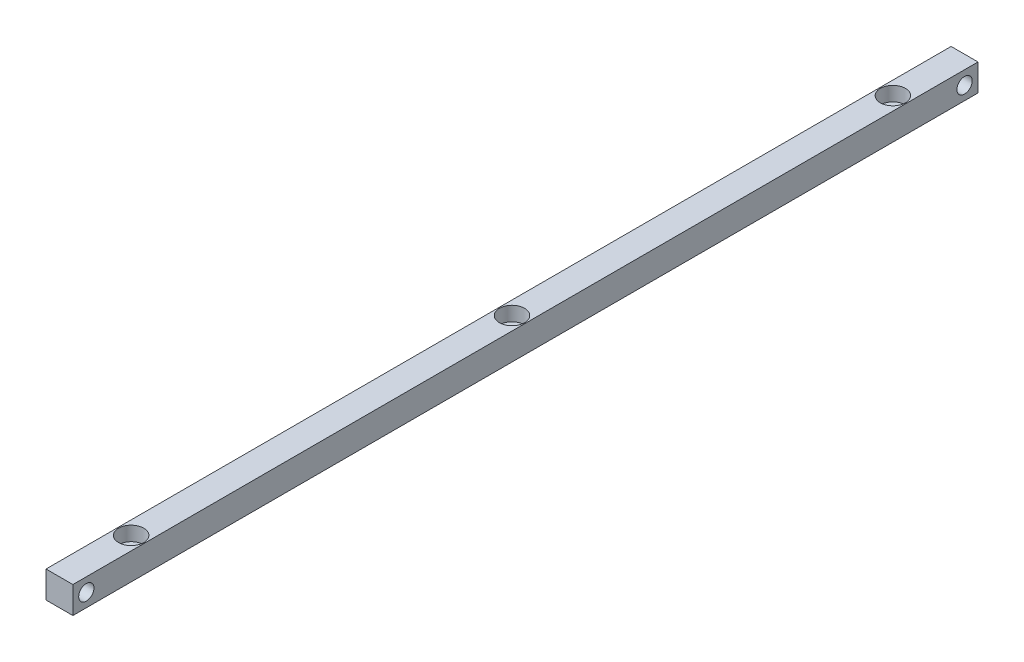
ISO-10303-21;
HEADER;
FILE_DESCRIPTION(('STEP AP214'),'2;1');
FILE_NAME('part.step','',(''),(''),'','','');
FILE_SCHEMA(('AUTOMOTIVE_DESIGN { 1 0 10303 214 1 1 1 1 }'));
ENDSEC;
DATA;
#1=APPLICATION_CONTEXT('core data for automotive mechanical design processes');
#2=APPLICATION_PROTOCOL_DEFINITION('international standard','automotive_design',2000,#1);
#3=PRODUCT_CONTEXT('',#1,'mechanical');
#4=PRODUCT('Part','Part','',(#3));
#5=PRODUCT_RELATED_PRODUCT_CATEGORY('part','',(#4));
#6=PRODUCT_DEFINITION_FORMATION('','',#4);
#7=PRODUCT_DEFINITION_CONTEXT('part definition',#1,'design');
#8=PRODUCT_DEFINITION('design','',#6,#7);
#9=PRODUCT_DEFINITION_SHAPE('','',#8);
#10=(LENGTH_UNIT() NAMED_UNIT(*) SI_UNIT(.MILLI.,.METRE.));
#11=(NAMED_UNIT(*) PLANE_ANGLE_UNIT() SI_UNIT($,.RADIAN.));
#12=(NAMED_UNIT(*) SI_UNIT($,.STERADIAN.) SOLID_ANGLE_UNIT());
#13=UNCERTAINTY_MEASURE_WITH_UNIT(LENGTH_MEASURE(1.E-05),#10,'distance_accuracy_value','');
#14=(GEOMETRIC_REPRESENTATION_CONTEXT(3) GLOBAL_UNCERTAINTY_ASSIGNED_CONTEXT((#13)) GLOBAL_UNIT_ASSIGNED_CONTEXT((#10,
#11,#12)) REPRESENTATION_CONTEXT('',''));
#15=CARTESIAN_POINT('',(0.,0.,0.));
#16=DIRECTION('',(0.,0.,1.));
#17=DIRECTION('',(1.,0.,0.));
#18=AXIS2_PLACEMENT_3D('',#15,#16,#17);
#19=CARTESIAN_POINT('',(0.,7.5,-212.5));
#20=DIRECTION('',(0.,1.,0.));
#21=DIRECTION('',(0.,0.,1.));
#22=AXIS2_PLACEMENT_3D('',#19,#20,#21);
#23=CYLINDRICAL_SURFACE('',#22,7.00000000000001);
#24=CARTESIAN_POINT('',(0.,-0.500000000000001,-212.5));
#25=DIRECTION('',(0.,1.,0.));
#26=DIRECTION('',(0.,0.,1.));
#27=AXIS2_PLACEMENT_3D('',#24,#25,#26);
#28=CIRCLE('',#27,7.00000000000001);
#29=CARTESIAN_POINT('',(0.,-0.500000000000001,-205.5));
#30=VERTEX_POINT('',#29);
#31=EDGE_CURVE('E11',#30,#30,#28,.T.);
#32=ORIENTED_EDGE('',*,*,#31,.F.);
#33=EDGE_LOOP('',(#32));
#34=FACE_BOUND('',#33,.T.);
#35=CARTESIAN_POINT('',(0.,7.5,-212.5));
#36=DIRECTION('',(0.,1.,0.));
#37=DIRECTION('',(0.,0.,1.));
#38=AXIS2_PLACEMENT_3D('',#35,#36,#37);
#39=CIRCLE('',#38,7.00000000000001);
#40=CARTESIAN_POINT('',(0.,7.5,-205.5));
#41=VERTEX_POINT('',#40);
#42=EDGE_CURVE('E128',#41,#41,#39,.T.);
#43=ORIENTED_EDGE('',*,*,#42,.T.);
#44=EDGE_LOOP('',(#43));
#45=FACE_BOUND('',#44,.T.);
#46=ADVANCED_FACE('F38',(#34,#45),#23,.F.);
#47=CARTESIAN_POINT('',(4.25000000000001,-0.500000000000001,-212.5));
#48=DIRECTION('',(0.,-1.,0.));
#49=DIRECTION('',(0.,0.,-1.));
#50=AXIS2_PLACEMENT_3D('',#47,#48,#49);
#51=PLANE('',#50);
#52=CARTESIAN_POINT('',(0.,-0.500000000000001,-212.5));
#53=DIRECTION('',(0.,1.,0.));
#54=DIRECTION('',(0.,0.,1.));
#55=AXIS2_PLACEMENT_3D('',#52,#53,#54);
#56=CIRCLE('',#55,4.25000000000001);
#57=CARTESIAN_POINT('',(0.,-0.500000000000001,-208.25));
#58=VERTEX_POINT('',#57);
#59=EDGE_CURVE('E47',#58,#58,#56,.T.);
#60=ORIENTED_EDGE('',*,*,#59,.F.);
#61=EDGE_LOOP('',(#60));
#62=FACE_BOUND('',#61,.T.);
#63=ORIENTED_EDGE('',*,*,#31,.T.);
#64=EDGE_LOOP('',(#63));
#65=FACE_BOUND('',#64,.T.);
#66=ADVANCED_FACE('F141',(#62,#65),#51,.F.);
#67=CARTESIAN_POINT('',(0.,7.5,-212.5));
#68=DIRECTION('',(0.,1.,0.));
#69=DIRECTION('',(0.,0.,1.));
#70=AXIS2_PLACEMENT_3D('',#67,#68,#69);
#71=CYLINDRICAL_SURFACE('',#70,4.25000000000001);
#72=CARTESIAN_POINT('',(0.,-7.5,-212.5));
#73=DIRECTION('',(0.,1.,0.));
#74=DIRECTION('',(0.,0.,1.));
#75=AXIS2_PLACEMENT_3D('',#72,#73,#74);
#76=CIRCLE('',#75,4.25000000000001);
#77=CARTESIAN_POINT('',(0.,-7.5,-208.25));
#78=VERTEX_POINT('',#77);
#79=EDGE_CURVE('E132',#78,#78,#76,.T.);
#80=ORIENTED_EDGE('',*,*,#79,.F.);
#81=EDGE_LOOP('',(#80));
#82=FACE_BOUND('',#81,.T.);
#83=ORIENTED_EDGE('',*,*,#59,.T.);
#84=EDGE_LOOP('',(#83));
#85=FACE_BOUND('',#84,.T.);
#86=ADVANCED_FACE('F139',(#82,#85),#71,.F.);
#87=CARTESIAN_POINT('',(7.5,-7.5,252.5));
#88=DIRECTION('',(-1.,0.,0.));
#89=DIRECTION('',(0.,0.,1.));
#90=AXIS2_PLACEMENT_3D('',#87,#88,#89);
#91=PLANE('',#90);
#92=CARTESIAN_POINT('',(7.5,0.,-245.));
#93=DIRECTION('',(-1.,0.,0.));
#94=DIRECTION('',(0.,0.,1.));
#95=AXIS2_PLACEMENT_3D('',#92,#93,#94);
#96=CIRCLE('',#95,4.25000000000001);
#97=CARTESIAN_POINT('',(7.5,0.,-240.75));
#98=VERTEX_POINT('',#97);
#99=EDGE_CURVE('E281',#98,#98,#96,.T.);
#100=ORIENTED_EDGE('',*,*,#99,.T.);
#101=EDGE_LOOP('',(#100));
#102=FACE_BOUND('',#101,.T.);
#103=CARTESIAN_POINT('',(7.5,0.,245.));
#104=DIRECTION('',(-1.,0.,0.));
#105=DIRECTION('',(0.,0.,1.));
#106=AXIS2_PLACEMENT_3D('',#103,#104,#105);
#107=CIRCLE('',#106,4.25000000000001);
#108=CARTESIAN_POINT('',(7.5,0.,249.25));
#109=VERTEX_POINT('',#108);
#110=EDGE_CURVE('E115',#109,#109,#107,.T.);
#111=ORIENTED_EDGE('',*,*,#110,.T.);
#112=EDGE_LOOP('',(#111));
#113=FACE_BOUND('',#112,.T.);
#114=DIRECTION('',(0.,1.,0.));
#115=VECTOR('',#114,1.);
#116=CARTESIAN_POINT('',(7.5,-7.5,-252.5));
#117=LINE('',#116,#115);
#118=CARTESIAN_POINT('',(7.5,-7.5,-252.5));
#119=VERTEX_POINT('',#118);
#120=CARTESIAN_POINT('',(7.5,7.5,-252.5));
#121=VERTEX_POINT('',#120);
#122=EDGE_CURVE('E111',#119,#121,#117,.T.);
#123=ORIENTED_EDGE('',*,*,#122,.T.);
#124=DIRECTION('',(0.,0.,-1.));
#125=VECTOR('',#124,1.);
#126=CARTESIAN_POINT('',(7.5,7.5,252.5));
#127=LINE('',#126,#125);
#128=CARTESIAN_POINT('',(7.5,7.5,252.5));
#129=VERTEX_POINT('',#128);
#130=EDGE_CURVE('E100',#129,#121,#127,.T.);
#131=ORIENTED_EDGE('',*,*,#130,.F.);
#132=DIRECTION('',(0.,1.,0.));
#133=VECTOR('',#132,1.);
#134=CARTESIAN_POINT('',(7.5,-7.5,252.5));
#135=LINE('',#134,#133);
#136=CARTESIAN_POINT('',(7.5,-7.5,252.5));
#137=VERTEX_POINT('',#136);
#138=EDGE_CURVE('E91',#137,#129,#135,.T.);
#139=ORIENTED_EDGE('',*,*,#138,.F.);
#140=DIRECTION('',(0.,0.,-1.));
#141=VECTOR('',#140,1.);
#142=CARTESIAN_POINT('',(7.5,-7.5,252.5));
#143=LINE('',#142,#141);
#144=EDGE_CURVE('E107',#137,#119,#143,.T.);
#145=ORIENTED_EDGE('',*,*,#144,.T.);
#146=EDGE_LOOP('',(#123,#131,#139,#145));
#147=FACE_BOUND('',#146,.T.);
#148=ADVANCED_FACE('F150',(#102,#113,#147),#91,.F.);
#149=CARTESIAN_POINT('',(-7.5,7.5,252.5));
#150=DIRECTION('',(0.,-1.,0.));
#151=DIRECTION('',(0.,0.,-1.));
#152=AXIS2_PLACEMENT_3D('',#149,#150,#151);
#153=PLANE('',#152);
#154=CARTESIAN_POINT('',(0.,7.5,0.));
#155=DIRECTION('',(0.,1.,0.));
#156=DIRECTION('',(0.,0.,1.));
#157=AXIS2_PLACEMENT_3D('',#154,#155,#156);
#158=CIRCLE('',#157,7.00000000000001);
#159=CARTESIAN_POINT('',(0.,7.5,7.00000000000001));
#160=VERTEX_POINT('',#159);
#161=EDGE_CURVE('E240',#160,#160,#158,.T.);
#162=ORIENTED_EDGE('',*,*,#161,.F.);
#163=EDGE_LOOP('',(#162));
#164=FACE_BOUND('',#163,.T.);
#165=CARTESIAN_POINT('',(0.,7.5,212.5));
#166=DIRECTION('',(0.,1.,0.));
#167=DIRECTION('',(0.,0.,1.));
#168=AXIS2_PLACEMENT_3D('',#165,#166,#167);
#169=CIRCLE('',#168,7.00000000000001);
#170=CARTESIAN_POINT('',(0.,7.5,219.5));
#171=VERTEX_POINT('',#170);
#172=EDGE_CURVE('E253',#171,#171,#169,.T.);
#173=ORIENTED_EDGE('',*,*,#172,.F.);
#174=EDGE_LOOP('',(#173));
#175=FACE_BOUND('',#174,.T.);
#176=DIRECTION('',(-1.,0.,0.));
#177=VECTOR('',#176,1.);
#178=CARTESIAN_POINT('',(-7.5,7.5,-252.5));
#179=LINE('',#178,#177);
#180=CARTESIAN_POINT('',(-7.5,7.5,-252.5));
#181=VERTEX_POINT('',#180);
#182=EDGE_CURVE('E98',#121,#181,#179,.T.);
#183=ORIENTED_EDGE('',*,*,#182,.T.);
#184=DIRECTION('',(0.,0.,-1.));
#185=VECTOR('',#184,1.);
#186=CARTESIAN_POINT('',(-7.5,7.5,252.5));
#187=LINE('',#186,#185);
#188=CARTESIAN_POINT('',(-7.5,7.5,252.5));
#189=VERTEX_POINT('',#188);
#190=EDGE_CURVE('E95',#189,#181,#187,.T.);
#191=ORIENTED_EDGE('',*,*,#190,.F.);
#192=DIRECTION('',(-1.,0.,0.));
#193=VECTOR('',#192,1.);
#194=CARTESIAN_POINT('',(-7.5,7.5,252.5));
#195=LINE('',#194,#193);
#196=EDGE_CURVE('E86',#129,#189,#195,.T.);
#197=ORIENTED_EDGE('',*,*,#196,.F.);
#198=ORIENTED_EDGE('',*,*,#130,.T.);
#199=EDGE_LOOP('',(#183,#191,#197,#198));
#200=FACE_BOUND('',#199,.T.);
#201=ORIENTED_EDGE('',*,*,#42,.F.);
#202=EDGE_LOOP('',(#201));
#203=FACE_BOUND('',#202,.T.);
#204=ADVANCED_FACE('F96',(#164,#175,#200,#203),#153,.F.);
#205=CARTESIAN_POINT('',(-7.5,-7.5,252.5));
#206=DIRECTION('',(1.,0.,0.));
#207=DIRECTION('',(0.,0.,-1.));
#208=AXIS2_PLACEMENT_3D('',#205,#206,#207);
#209=PLANE('',#208);
#210=CARTESIAN_POINT('',(-7.5,0.,-245.));
#211=DIRECTION('',(-1.,0.,0.));
#212=DIRECTION('',(0.,0.,1.));
#213=AXIS2_PLACEMENT_3D('',#210,#211,#212);
#214=CIRCLE('',#213,7.00000000000001);
#215=CARTESIAN_POINT('',(-7.5,0.,-238.));
#216=VERTEX_POINT('',#215);
#217=EDGE_CURVE('E269',#216,#216,#214,.T.);
#218=ORIENTED_EDGE('',*,*,#217,.F.);
#219=EDGE_LOOP('',(#218));
#220=FACE_BOUND('',#219,.T.);
#221=CARTESIAN_POINT('',(-7.5,0.,245.));
#222=DIRECTION('',(-1.,0.,0.));
#223=DIRECTION('',(0.,0.,1.));
#224=AXIS2_PLACEMENT_3D('',#221,#222,#223);
#225=CIRCLE('',#224,7.00000000000001);
#226=CARTESIAN_POINT('',(-7.5,0.,252.));
#227=VERTEX_POINT('',#226);
#228=EDGE_CURVE('E285',#227,#227,#225,.T.);
#229=ORIENTED_EDGE('',*,*,#228,.F.);
#230=EDGE_LOOP('',(#229));
#231=FACE_BOUND('',#230,.T.);
#232=DIRECTION('',(0.,-1.,0.));
#233=VECTOR('',#232,1.);
#234=CARTESIAN_POINT('',(-7.5,-7.5,-252.5));
#235=LINE('',#234,#233);
#236=CARTESIAN_POINT('',(-7.5,-7.5,-252.5));
#237=VERTEX_POINT('',#236);
#238=EDGE_CURVE('E72',#181,#237,#235,.T.);
#239=ORIENTED_EDGE('',*,*,#238,.T.);
#240=DIRECTION('',(0.,0.,-1.));
#241=VECTOR('',#240,1.);
#242=CARTESIAN_POINT('',(-7.5,-7.5,252.5));
#243=LINE('',#242,#241);
#244=CARTESIAN_POINT('',(-7.5,-7.5,252.5));
#245=VERTEX_POINT('',#244);
#246=EDGE_CURVE('E101',#245,#237,#243,.T.);
#247=ORIENTED_EDGE('',*,*,#246,.F.);
#248=DIRECTION('',(0.,-1.,0.));
#249=VECTOR('',#248,1.);
#250=CARTESIAN_POINT('',(-7.5,-7.5,252.5));
#251=LINE('',#250,#249);
#252=EDGE_CURVE('E89',#189,#245,#251,.T.);
#253=ORIENTED_EDGE('',*,*,#252,.F.);
#254=ORIENTED_EDGE('',*,*,#190,.T.);
#255=EDGE_LOOP('',(#239,#247,#253,#254));
#256=FACE_BOUND('',#255,.T.);
#257=ADVANCED_FACE('F103',(#220,#231,#256),#209,.F.);
#258=CARTESIAN_POINT('',(-7.5,-7.5,252.5));
#259=DIRECTION('',(0.,1.,0.));
#260=DIRECTION('',(0.,0.,1.));
#261=AXIS2_PLACEMENT_3D('',#258,#259,#260);
#262=PLANE('',#261);
#263=CARTESIAN_POINT('',(0.,-7.5,0.));
#264=DIRECTION('',(0.,1.,0.));
#265=DIRECTION('',(0.,0.,1.));
#266=AXIS2_PLACEMENT_3D('',#263,#264,#265);
#267=CIRCLE('',#266,4.25000000000001);
#268=CARTESIAN_POINT('',(0.,-7.5,4.25000000000001));
#269=VERTEX_POINT('',#268);
#270=EDGE_CURVE('E242',#269,#269,#267,.T.);
#271=ORIENTED_EDGE('',*,*,#270,.T.);
#272=EDGE_LOOP('',(#271));
#273=FACE_BOUND('',#272,.T.);
#274=CARTESIAN_POINT('',(0.,-7.5,212.5));
#275=DIRECTION('',(0.,1.,0.));
#276=DIRECTION('',(0.,0.,1.));
#277=AXIS2_PLACEMENT_3D('',#274,#275,#276);
#278=CIRCLE('',#277,4.25000000000001);
#279=CARTESIAN_POINT('',(0.,-7.5,216.75));
#280=VERTEX_POINT('',#279);
#281=EDGE_CURVE('E265',#280,#280,#278,.T.);
#282=ORIENTED_EDGE('',*,*,#281,.T.);
#283=EDGE_LOOP('',(#282));
#284=FACE_BOUND('',#283,.T.);
#285=DIRECTION('',(1.,0.,0.));
#286=VECTOR('',#285,1.);
#287=CARTESIAN_POINT('',(-7.5,-7.5,-252.5));
#288=LINE('',#287,#286);
#289=EDGE_CURVE('E78',#237,#119,#288,.T.);
#290=ORIENTED_EDGE('',*,*,#289,.T.);
#291=ORIENTED_EDGE('',*,*,#144,.F.);
#292=DIRECTION('',(1.,0.,0.));
#293=VECTOR('',#292,1.);
#294=CARTESIAN_POINT('',(-7.5,-7.5,252.5));
#295=LINE('',#294,#293);
#296=EDGE_CURVE('E55',#245,#137,#295,.T.);
#297=ORIENTED_EDGE('',*,*,#296,.F.);
#298=ORIENTED_EDGE('',*,*,#246,.T.);
#299=EDGE_LOOP('',(#290,#291,#297,#298));
#300=FACE_BOUND('',#299,.T.);
#301=ORIENTED_EDGE('',*,*,#79,.T.);
#302=EDGE_LOOP('',(#301));
#303=FACE_BOUND('',#302,.T.);
#304=ADVANCED_FACE('F158',(#273,#284,#300,#303),#262,.F.);
#305=CARTESIAN_POINT('',(0.,0.,252.5));
#306=DIRECTION('',(0.,0.,-1.));
#307=DIRECTION('',(-1.,0.,0.));
#308=AXIS2_PLACEMENT_3D('',#305,#306,#307);
#309=PLANE('',#308);
#310=ORIENTED_EDGE('',*,*,#138,.T.);
#311=ORIENTED_EDGE('',*,*,#196,.T.);
#312=ORIENTED_EDGE('',*,*,#252,.T.);
#313=ORIENTED_EDGE('',*,*,#296,.T.);
#314=EDGE_LOOP('',(#310,#311,#312,#313));
#315=FACE_BOUND('',#314,.T.);
#316=ADVANCED_FACE('F87',(#315),#309,.F.);
#317=CARTESIAN_POINT('',(0.,0.,-252.5));
#318=DIRECTION('',(0.,0.,-1.));
#319=DIRECTION('',(-1.,0.,0.));
#320=AXIS2_PLACEMENT_3D('',#317,#318,#319);
#321=PLANE('',#320);
#322=ORIENTED_EDGE('',*,*,#122,.F.);
#323=ORIENTED_EDGE('',*,*,#289,.F.);
#324=ORIENTED_EDGE('',*,*,#238,.F.);
#325=ORIENTED_EDGE('',*,*,#182,.F.);
#326=EDGE_LOOP('',(#322,#323,#324,#325));
#327=FACE_BOUND('',#326,.T.);
#328=ADVANCED_FACE('F179',(#327),#321,.T.);
#329=CARTESIAN_POINT('',(-7.5,0.,245.));
#330=DIRECTION('',(-1.,0.,0.));
#331=DIRECTION('',(0.,0.,1.));
#332=AXIS2_PLACEMENT_3D('',#329,#330,#331);
#333=CYLINDRICAL_SURFACE('',#332,4.25000000000001);
#334=ORIENTED_EDGE('',*,*,#110,.F.);
#335=EDGE_LOOP('',(#334));
#336=FACE_BOUND('',#335,.T.);
#337=CARTESIAN_POINT('',(0.499999999999999,0.,245.));
#338=DIRECTION('',(-1.,0.,0.));
#339=DIRECTION('',(0.,0.,1.));
#340=AXIS2_PLACEMENT_3D('',#337,#338,#339);
#341=CIRCLE('',#340,4.25000000000001);
#342=CARTESIAN_POINT('',(0.499999999999999,0.,249.25));
#343=VERTEX_POINT('',#342);
#344=EDGE_CURVE('E293',#343,#343,#341,.T.);
#345=ORIENTED_EDGE('',*,*,#344,.T.);
#346=EDGE_LOOP('',(#345));
#347=FACE_BOUND('',#346,.T.);
#348=ADVANCED_FACE('F185',(#336,#347),#333,.F.);
#349=CARTESIAN_POINT('',(0.499999999999999,4.25000000000001,245.));
#350=DIRECTION('',(1.,0.,0.));
#351=DIRECTION('',(0.,0.,-1.));
#352=AXIS2_PLACEMENT_3D('',#349,#350,#351);
#353=PLANE('',#352);
#354=ORIENTED_EDGE('',*,*,#344,.F.);
#355=EDGE_LOOP('',(#354));
#356=FACE_BOUND('',#355,.T.);
#357=CARTESIAN_POINT('',(0.499999999999999,0.,245.));
#358=DIRECTION('',(-1.,0.,0.));
#359=DIRECTION('',(0.,0.,1.));
#360=AXIS2_PLACEMENT_3D('',#357,#358,#359);
#361=CIRCLE('',#360,7.00000000000001);
#362=CARTESIAN_POINT('',(0.499999999999999,0.,252.));
#363=VERTEX_POINT('',#362);
#364=EDGE_CURVE('E289',#363,#363,#361,.T.);
#365=ORIENTED_EDGE('',*,*,#364,.T.);
#366=EDGE_LOOP('',(#365));
#367=FACE_BOUND('',#366,.T.);
#368=ADVANCED_FACE('F190',(#356,#367),#353,.F.);
#369=CARTESIAN_POINT('',(-7.5,0.,245.));
#370=DIRECTION('',(-1.,0.,0.));
#371=DIRECTION('',(0.,0.,1.));
#372=AXIS2_PLACEMENT_3D('',#369,#370,#371);
#373=CYLINDRICAL_SURFACE('',#372,7.00000000000001);
#374=ORIENTED_EDGE('',*,*,#364,.F.);
#375=EDGE_LOOP('',(#374));
#376=FACE_BOUND('',#375,.T.);
#377=ORIENTED_EDGE('',*,*,#228,.T.);
#378=EDGE_LOOP('',(#377));
#379=FACE_BOUND('',#378,.T.);
#380=ADVANCED_FACE('F194',(#376,#379),#373,.F.);
#381=CARTESIAN_POINT('',(-7.5,0.,-245.));
#382=DIRECTION('',(-1.,0.,0.));
#383=DIRECTION('',(0.,0.,1.));
#384=AXIS2_PLACEMENT_3D('',#381,#382,#383);
#385=CYLINDRICAL_SURFACE('',#384,4.25000000000001);
#386=ORIENTED_EDGE('',*,*,#99,.F.);
#387=EDGE_LOOP('',(#386));
#388=FACE_BOUND('',#387,.T.);
#389=CARTESIAN_POINT('',(0.499999999999999,0.,-245.));
#390=DIRECTION('',(-1.,0.,0.));
#391=DIRECTION('',(0.,0.,1.));
#392=AXIS2_PLACEMENT_3D('',#389,#390,#391);
#393=CIRCLE('',#392,4.25000000000001);
#394=CARTESIAN_POINT('',(0.499999999999999,0.,-240.75));
#395=VERTEX_POINT('',#394);
#396=EDGE_CURVE('E277',#395,#395,#393,.T.);
#397=ORIENTED_EDGE('',*,*,#396,.T.);
#398=EDGE_LOOP('',(#397));
#399=FACE_BOUND('',#398,.T.);
#400=ADVANCED_FACE('F198',(#388,#399),#385,.F.);
#401=CARTESIAN_POINT('',(0.499999999999999,4.25000000000001,-245.));
#402=DIRECTION('',(1.,0.,0.));
#403=DIRECTION('',(0.,0.,-1.));
#404=AXIS2_PLACEMENT_3D('',#401,#402,#403);
#405=PLANE('',#404);
#406=ORIENTED_EDGE('',*,*,#396,.F.);
#407=EDGE_LOOP('',(#406));
#408=FACE_BOUND('',#407,.T.);
#409=CARTESIAN_POINT('',(0.499999999999999,0.,-245.));
#410=DIRECTION('',(-1.,0.,0.));
#411=DIRECTION('',(0.,0.,1.));
#412=AXIS2_PLACEMENT_3D('',#409,#410,#411);
#413=CIRCLE('',#412,7.00000000000001);
#414=CARTESIAN_POINT('',(0.499999999999999,0.,-238.));
#415=VERTEX_POINT('',#414);
#416=EDGE_CURVE('E273',#415,#415,#413,.T.);
#417=ORIENTED_EDGE('',*,*,#416,.T.);
#418=EDGE_LOOP('',(#417));
#419=FACE_BOUND('',#418,.T.);
#420=ADVANCED_FACE('F202',(#408,#419),#405,.F.);
#421=CARTESIAN_POINT('',(-7.5,0.,-245.));
#422=DIRECTION('',(-1.,0.,0.));
#423=DIRECTION('',(0.,0.,1.));
#424=AXIS2_PLACEMENT_3D('',#421,#422,#423);
#425=CYLINDRICAL_SURFACE('',#424,7.00000000000001);
#426=ORIENTED_EDGE('',*,*,#416,.F.);
#427=EDGE_LOOP('',(#426));
#428=FACE_BOUND('',#427,.T.);
#429=ORIENTED_EDGE('',*,*,#217,.T.);
#430=EDGE_LOOP('',(#429));
#431=FACE_BOUND('',#430,.T.);
#432=ADVANCED_FACE('F206',(#428,#431),#425,.F.);
#433=CARTESIAN_POINT('',(0.,7.5,212.5));
#434=DIRECTION('',(0.,1.,0.));
#435=DIRECTION('',(0.,0.,1.));
#436=AXIS2_PLACEMENT_3D('',#433,#434,#435);
#437=CYLINDRICAL_SURFACE('',#436,4.25000000000001);
#438=ORIENTED_EDGE('',*,*,#281,.F.);
#439=EDGE_LOOP('',(#438));
#440=FACE_BOUND('',#439,.T.);
#441=CARTESIAN_POINT('',(0.,-0.500000000000001,212.5));
#442=DIRECTION('',(0.,1.,0.));
#443=DIRECTION('',(0.,0.,1.));
#444=AXIS2_PLACEMENT_3D('',#441,#442,#443);
#445=CIRCLE('',#444,4.25000000000001);
#446=CARTESIAN_POINT('',(0.,-0.500000000000001,216.75));
#447=VERTEX_POINT('',#446);
#448=EDGE_CURVE('E261',#447,#447,#445,.T.);
#449=ORIENTED_EDGE('',*,*,#448,.T.);
#450=EDGE_LOOP('',(#449));
#451=FACE_BOUND('',#450,.T.);
#452=ADVANCED_FACE('F210',(#440,#451),#437,.F.);
#453=CARTESIAN_POINT('',(4.25000000000001,-0.500000000000001,212.5));
#454=DIRECTION('',(0.,-1.,0.));
#455=DIRECTION('',(0.,0.,-1.));
#456=AXIS2_PLACEMENT_3D('',#453,#454,#455);
#457=PLANE('',#456);
#458=ORIENTED_EDGE('',*,*,#448,.F.);
#459=EDGE_LOOP('',(#458));
#460=FACE_BOUND('',#459,.T.);
#461=CARTESIAN_POINT('',(0.,-0.500000000000001,212.5));
#462=DIRECTION('',(0.,1.,0.));
#463=DIRECTION('',(0.,0.,1.));
#464=AXIS2_PLACEMENT_3D('',#461,#462,#463);
#465=CIRCLE('',#464,7.00000000000001);
#466=CARTESIAN_POINT('',(0.,-0.500000000000001,219.5));
#467=VERTEX_POINT('',#466);
#468=EDGE_CURVE('E257',#467,#467,#465,.T.);
#469=ORIENTED_EDGE('',*,*,#468,.T.);
#470=EDGE_LOOP('',(#469));
#471=FACE_BOUND('',#470,.T.);
#472=ADVANCED_FACE('F213',(#460,#471),#457,.F.);
#473=CARTESIAN_POINT('',(0.,7.5,212.5));
#474=DIRECTION('',(0.,1.,0.));
#475=DIRECTION('',(0.,0.,1.));
#476=AXIS2_PLACEMENT_3D('',#473,#474,#475);
#477=CYLINDRICAL_SURFACE('',#476,7.00000000000001);
#478=ORIENTED_EDGE('',*,*,#468,.F.);
#479=EDGE_LOOP('',(#478));
#480=FACE_BOUND('',#479,.T.);
#481=ORIENTED_EDGE('',*,*,#172,.T.);
#482=EDGE_LOOP('',(#481));
#483=FACE_BOUND('',#482,.T.);
#484=ADVANCED_FACE('F217',(#480,#483),#477,.F.);
#485=CARTESIAN_POINT('',(0.,7.5,0.));
#486=DIRECTION('',(0.,1.,0.));
#487=DIRECTION('',(0.,0.,1.));
#488=AXIS2_PLACEMENT_3D('',#485,#486,#487);
#489=CYLINDRICAL_SURFACE('',#488,4.25000000000001);
#490=ORIENTED_EDGE('',*,*,#270,.F.);
#491=EDGE_LOOP('',(#490));
#492=FACE_BOUND('',#491,.T.);
#493=CARTESIAN_POINT('',(0.,-0.500000000000001,0.));
#494=DIRECTION('',(0.,1.,0.));
#495=DIRECTION('',(0.,0.,1.));
#496=AXIS2_PLACEMENT_3D('',#493,#494,#495);
#497=CIRCLE('',#496,4.25000000000001);
#498=CARTESIAN_POINT('',(0.,-0.500000000000001,4.25000000000001));
#499=VERTEX_POINT('',#498);
#500=EDGE_CURVE('E249',#499,#499,#497,.T.);
#501=ORIENTED_EDGE('',*,*,#500,.T.);
#502=EDGE_LOOP('',(#501));
#503=FACE_BOUND('',#502,.T.);
#504=ADVANCED_FACE('F221',(#492,#503),#489,.F.);
#505=CARTESIAN_POINT('',(4.25000000000001,-0.500000000000001,0.));
#506=DIRECTION('',(0.,-1.,0.));
#507=DIRECTION('',(0.,0.,-1.));
#508=AXIS2_PLACEMENT_3D('',#505,#506,#507);
#509=PLANE('',#508);
#510=ORIENTED_EDGE('',*,*,#500,.F.);
#511=EDGE_LOOP('',(#510));
#512=FACE_BOUND('',#511,.T.);
#513=CARTESIAN_POINT('',(0.,-0.500000000000001,0.));
#514=DIRECTION('',(0.,1.,0.));
#515=DIRECTION('',(0.,0.,1.));
#516=AXIS2_PLACEMENT_3D('',#513,#514,#515);
#517=CIRCLE('',#516,7.00000000000001);
#518=CARTESIAN_POINT('',(0.,-0.500000000000001,7.00000000000001));
#519=VERTEX_POINT('',#518);
#520=EDGE_CURVE('E238',#519,#519,#517,.T.);
#521=ORIENTED_EDGE('',*,*,#520,.T.);
#522=EDGE_LOOP('',(#521));
#523=FACE_BOUND('',#522,.T.);
#524=ADVANCED_FACE('F225',(#512,#523),#509,.F.);
#525=CARTESIAN_POINT('',(0.,7.5,0.));
#526=DIRECTION('',(0.,1.,0.));
#527=DIRECTION('',(0.,0.,1.));
#528=AXIS2_PLACEMENT_3D('',#525,#526,#527);
#529=CYLINDRICAL_SURFACE('',#528,7.00000000000001);
#530=ORIENTED_EDGE('',*,*,#520,.F.);
#531=EDGE_LOOP('',(#530));
#532=FACE_BOUND('',#531,.T.);
#533=ORIENTED_EDGE('',*,*,#161,.T.);
#534=EDGE_LOOP('',(#533));
#535=FACE_BOUND('',#534,.T.);
#536=ADVANCED_FACE('F229',(#532,#535),#529,.F.);
#537=CLOSED_SHELL('',(#46,#66,#86,#148,#204,#257,#304,#316,#328,#348,#368,#380,#400,#420,#432,
#452,#472,#484,#504,#524,#536));
#538=MANIFOLD_SOLID_BREP('B2',#537);
#539=ADVANCED_BREP_SHAPE_REPRESENTATION('',(#18,#538),#14);
#540=SHAPE_DEFINITION_REPRESENTATION(#9,#539);
ENDSEC;
END-ISO-10303-21;
